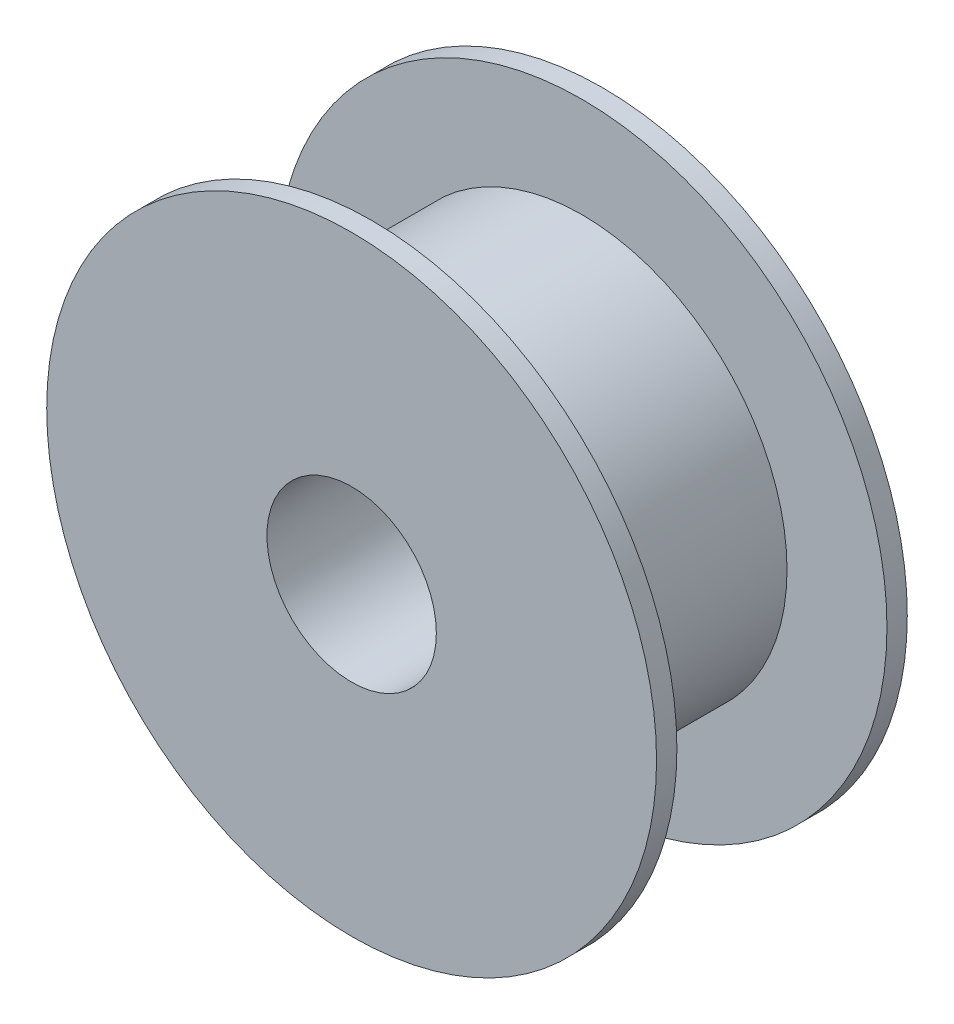
ISO-10303-21;
HEADER;
FILE_DESCRIPTION(('STEP AP214'),'2;1');
FILE_NAME('part.step','',(''),(''),'','','');
FILE_SCHEMA(('AUTOMOTIVE_DESIGN { 1 0 10303 214 1 1 1 1 }'));
ENDSEC;
DATA;
#1=APPLICATION_CONTEXT('core data for automotive mechanical design processes');
#2=APPLICATION_PROTOCOL_DEFINITION('international standard','automotive_design',2000,#1);
#3=PRODUCT_CONTEXT('',#1,'mechanical');
#4=PRODUCT('Part','Part','',(#3));
#5=PRODUCT_RELATED_PRODUCT_CATEGORY('part','',(#4));
#6=PRODUCT_DEFINITION_FORMATION('','',#4);
#7=PRODUCT_DEFINITION_CONTEXT('part definition',#1,'design');
#8=PRODUCT_DEFINITION('design','',#6,#7);
#9=PRODUCT_DEFINITION_SHAPE('','',#8);
#10=(LENGTH_UNIT() NAMED_UNIT(*) SI_UNIT(.MILLI.,.METRE.));
#11=(NAMED_UNIT(*) PLANE_ANGLE_UNIT() SI_UNIT($,.RADIAN.));
#12=(NAMED_UNIT(*) SI_UNIT($,.STERADIAN.) SOLID_ANGLE_UNIT());
#13=UNCERTAINTY_MEASURE_WITH_UNIT(LENGTH_MEASURE(1.E-05),#10,'distance_accuracy_value','');
#14=(GEOMETRIC_REPRESENTATION_CONTEXT(3) GLOBAL_UNCERTAINTY_ASSIGNED_CONTEXT((#13)) GLOBAL_UNIT_ASSIGNED_CONTEXT((#10,
#11,#12)) REPRESENTATION_CONTEXT('',''));
#15=CARTESIAN_POINT('',(0.,0.,0.));
#16=DIRECTION('',(0.,0.,1.));
#17=DIRECTION('',(1.,0.,0.));
#18=AXIS2_PLACEMENT_3D('',#15,#16,#17);
#19=CARTESIAN_POINT('',(0.,0.,7.4));
#20=DIRECTION('',(0.,0.,-1.));
#21=DIRECTION('',(-1.,0.,0.));
#22=AXIS2_PLACEMENT_3D('',#19,#20,#21);
#23=CYLINDRICAL_SURFACE('',#22,6.05);
#24=CARTESIAN_POINT('',(0.,0.,6.8));
#25=DIRECTION('',(0.,0.,1.));
#26=DIRECTION('',(1.,0.,0.));
#27=AXIS2_PLACEMENT_3D('',#24,#25,#26);
#28=CIRCLE('',#27,6.05);
#29=CARTESIAN_POINT('',(6.05,0.,6.8));
#30=VERTEX_POINT('',#29);
#31=EDGE_CURVE('E36',#30,#30,#28,.T.);
#32=ORIENTED_EDGE('',*,*,#31,.F.);
#33=EDGE_LOOP('',(#32));
#34=FACE_BOUND('',#33,.T.);
#35=CARTESIAN_POINT('',(0.,0.,0.6));
#36=DIRECTION('',(0.,0.,-1.));
#37=DIRECTION('',(-1.,0.,0.));
#38=AXIS2_PLACEMENT_3D('',#35,#36,#37);
#39=CIRCLE('',#38,6.05);
#40=CARTESIAN_POINT('',(-6.05,0.,0.6));
#41=VERTEX_POINT('',#40);
#42=EDGE_CURVE('E10',#41,#41,#39,.T.);
#43=ORIENTED_EDGE('',*,*,#42,.F.);
#44=EDGE_LOOP('',(#43));
#45=FACE_BOUND('',#44,.T.);
#46=ADVANCED_FACE('F33',(#34,#45),#23,.T.);
#47=CARTESIAN_POINT('',(0.,0.,6.8));
#48=DIRECTION('',(0.,0.,1.));
#49=DIRECTION('',(1.,0.,0.));
#50=AXIS2_PLACEMENT_3D('',#47,#48,#49);
#51=CYLINDRICAL_SURFACE('',#50,9.);
#52=CARTESIAN_POINT('',(0.,0.,6.8));
#53=DIRECTION('',(0.,0.,1.));
#54=DIRECTION('',(1.,0.,0.));
#55=AXIS2_PLACEMENT_3D('',#52,#53,#54);
#56=CIRCLE('',#55,9.);
#57=CARTESIAN_POINT('',(9.,0.,6.8));
#58=VERTEX_POINT('',#57);
#59=EDGE_CURVE('E44',#58,#58,#56,.T.);
#60=ORIENTED_EDGE('',*,*,#59,.T.);
#61=EDGE_LOOP('',(#60));
#62=FACE_BOUND('',#61,.T.);
#63=CARTESIAN_POINT('',(0.,0.,7.4));
#64=DIRECTION('',(0.,0.,1.));
#65=DIRECTION('',(1.,0.,0.));
#66=AXIS2_PLACEMENT_3D('',#63,#64,#65);
#67=CIRCLE('',#66,9.);
#68=CARTESIAN_POINT('',(9.,0.,7.4));
#69=VERTEX_POINT('',#68);
#70=EDGE_CURVE('E50',#69,#69,#67,.T.);
#71=ORIENTED_EDGE('',*,*,#70,.F.);
#72=EDGE_LOOP('',(#71));
#73=FACE_BOUND('',#72,.T.);
#74=ADVANCED_FACE('F87',(#62,#73),#51,.T.);
#75=CARTESIAN_POINT('',(0.,0.,6.8));
#76=DIRECTION('',(0.,0.,1.));
#77=DIRECTION('',(1.,0.,0.));
#78=AXIS2_PLACEMENT_3D('',#75,#76,#77);
#79=PLANE('',#78);
#80=ORIENTED_EDGE('',*,*,#31,.T.);
#81=EDGE_LOOP('',(#80));
#82=FACE_BOUND('',#81,.T.);
#83=ORIENTED_EDGE('',*,*,#59,.F.);
#84=EDGE_LOOP('',(#83));
#85=FACE_BOUND('',#84,.T.);
#86=ADVANCED_FACE('F79',(#82,#85),#79,.F.);
#87=CARTESIAN_POINT('',(0.,0.,7.4));
#88=DIRECTION('',(0.,0.,1.));
#89=DIRECTION('',(1.,0.,0.));
#90=AXIS2_PLACEMENT_3D('',#87,#88,#89);
#91=PLANE('',#90);
#92=CARTESIAN_POINT('',(0.,0.,7.4));
#93=DIRECTION('',(0.,0.,1.));
#94=DIRECTION('',(1.,0.,0.));
#95=AXIS2_PLACEMENT_3D('',#92,#93,#94);
#96=CIRCLE('',#95,2.5);
#97=CARTESIAN_POINT('',(2.5,0.,7.4));
#98=VERTEX_POINT('',#97);
#99=EDGE_CURVE('E61',#98,#98,#96,.T.);
#100=ORIENTED_EDGE('',*,*,#99,.F.);
#101=EDGE_LOOP('',(#100));
#102=FACE_BOUND('',#101,.T.);
#103=ORIENTED_EDGE('',*,*,#70,.T.);
#104=EDGE_LOOP('',(#103));
#105=FACE_BOUND('',#104,.T.);
#106=ADVANCED_FACE('F76',(#102,#105),#91,.T.);
#107=CARTESIAN_POINT('',(0.,0.,0.6));
#108=DIRECTION('',(0.,0.,-1.));
#109=DIRECTION('',(-1.,0.,0.));
#110=AXIS2_PLACEMENT_3D('',#107,#108,#109);
#111=CYLINDRICAL_SURFACE('',#110,9.);
#112=CARTESIAN_POINT('',(0.,0.,0.6));
#113=DIRECTION('',(0.,0.,-1.));
#114=DIRECTION('',(-1.,0.,0.));
#115=AXIS2_PLACEMENT_3D('',#112,#113,#114);
#116=CIRCLE('',#115,9.);
#117=CARTESIAN_POINT('',(-9.,0.,0.6));
#118=VERTEX_POINT('',#117);
#119=EDGE_CURVE('E52',#118,#118,#116,.T.);
#120=ORIENTED_EDGE('',*,*,#119,.T.);
#121=EDGE_LOOP('',(#120));
#122=FACE_BOUND('',#121,.T.);
#123=CARTESIAN_POINT('',(0.,0.,0.));
#124=DIRECTION('',(0.,0.,-1.));
#125=DIRECTION('',(-1.,0.,0.));
#126=AXIS2_PLACEMENT_3D('',#123,#124,#125);
#127=CIRCLE('',#126,9.);
#128=CARTESIAN_POINT('',(-9.,0.,0.));
#129=VERTEX_POINT('',#128);
#130=EDGE_CURVE('E47',#129,#129,#127,.T.);
#131=ORIENTED_EDGE('',*,*,#130,.F.);
#132=EDGE_LOOP('',(#131));
#133=FACE_BOUND('',#132,.T.);
#134=ADVANCED_FACE('F78',(#122,#133),#111,.T.);
#135=CARTESIAN_POINT('',(0.,0.,0.6));
#136=DIRECTION('',(0.,0.,-1.));
#137=DIRECTION('',(-1.,0.,0.));
#138=AXIS2_PLACEMENT_3D('',#135,#136,#137);
#139=PLANE('',#138);
#140=ORIENTED_EDGE('',*,*,#42,.T.);
#141=EDGE_LOOP('',(#140));
#142=FACE_BOUND('',#141,.T.);
#143=ORIENTED_EDGE('',*,*,#119,.F.);
#144=EDGE_LOOP('',(#143));
#145=FACE_BOUND('',#144,.T.);
#146=ADVANCED_FACE('F85',(#142,#145),#139,.F.);
#147=CARTESIAN_POINT('',(0.,0.,0.));
#148=DIRECTION('',(0.,0.,1.));
#149=DIRECTION('',(1.,0.,0.));
#150=AXIS2_PLACEMENT_3D('',#147,#148,#149);
#151=PLANE('',#150);
#152=CARTESIAN_POINT('',(0.,0.,0.));
#153=DIRECTION('',(0.,0.,1.));
#154=DIRECTION('',(1.,0.,0.));
#155=AXIS2_PLACEMENT_3D('',#152,#153,#154);
#156=CIRCLE('',#155,2.5);
#157=CARTESIAN_POINT('',(2.5,0.,0.));
#158=VERTEX_POINT('',#157);
#159=EDGE_CURVE('E59',#158,#158,#156,.T.);
#160=ORIENTED_EDGE('',*,*,#159,.T.);
#161=EDGE_LOOP('',(#160));
#162=FACE_BOUND('',#161,.T.);
#163=ORIENTED_EDGE('',*,*,#130,.T.);
#164=EDGE_LOOP('',(#163));
#165=FACE_BOUND('',#164,.T.);
#166=ADVANCED_FACE('F67',(#162,#165),#151,.F.);
#167=CARTESIAN_POINT('',(0.,0.,7.4));
#168=DIRECTION('',(0.,0.,-1.));
#169=DIRECTION('',(-1.,0.,0.));
#170=AXIS2_PLACEMENT_3D('',#167,#168,#169);
#171=CYLINDRICAL_SURFACE('',#170,2.5);
#172=ORIENTED_EDGE('',*,*,#159,.F.);
#173=EDGE_LOOP('',(#172));
#174=FACE_BOUND('',#173,.T.);
#175=ORIENTED_EDGE('',*,*,#99,.T.);
#176=EDGE_LOOP('',(#175));
#177=FACE_BOUND('',#176,.T.);
#178=ADVANCED_FACE('F70',(#174,#177),#171,.F.);
#179=CLOSED_SHELL('',(#46,#74,#86,#106,#134,#146,#166,#178));
#180=MANIFOLD_SOLID_BREP('B2',#179);
#181=ADVANCED_BREP_SHAPE_REPRESENTATION('',(#18,#180),#14);
#182=SHAPE_DEFINITION_REPRESENTATION(#9,#181);
ENDSEC;
END-ISO-10303-21;
